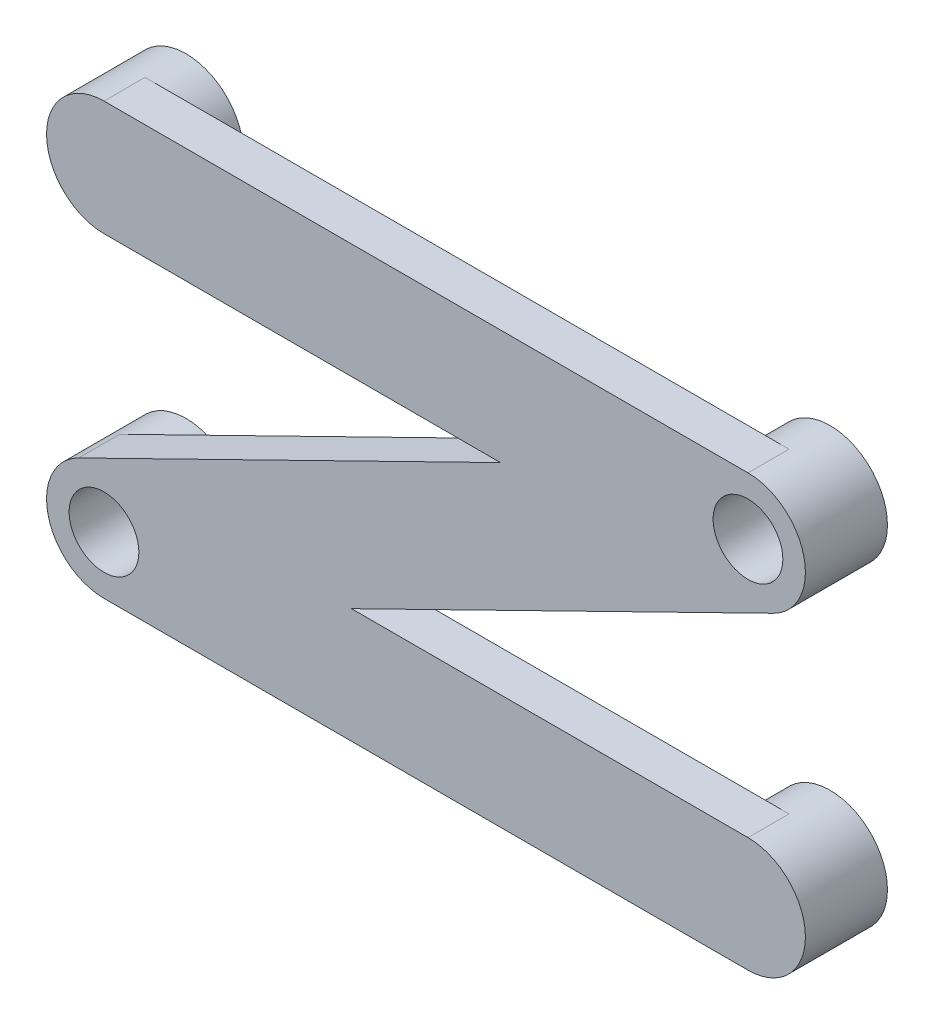
ISO-10303-21;
HEADER;
FILE_DESCRIPTION(('STEP AP214'),'2;1');
FILE_NAME('part.step','',(''),(''),'','','');
FILE_SCHEMA(('AUTOMOTIVE_DESIGN { 1 0 10303 214 1 1 1 1 }'));
ENDSEC;
DATA;
#1=APPLICATION_CONTEXT('core data for automotive mechanical design processes');
#2=APPLICATION_PROTOCOL_DEFINITION('international standard','automotive_design',2000,#1);
#3=PRODUCT_CONTEXT('',#1,'mechanical');
#4=PRODUCT('Part','Part','',(#3));
#5=PRODUCT_RELATED_PRODUCT_CATEGORY('part','',(#4));
#6=PRODUCT_DEFINITION_FORMATION('','',#4);
#7=PRODUCT_DEFINITION_CONTEXT('part definition',#1,'design');
#8=PRODUCT_DEFINITION('design','',#6,#7);
#9=PRODUCT_DEFINITION_SHAPE('','',#8);
#10=(LENGTH_UNIT() NAMED_UNIT(*) SI_UNIT(.MILLI.,.METRE.));
#11=(NAMED_UNIT(*) PLANE_ANGLE_UNIT() SI_UNIT($,.RADIAN.));
#12=(NAMED_UNIT(*) SI_UNIT($,.STERADIAN.) SOLID_ANGLE_UNIT());
#13=UNCERTAINTY_MEASURE_WITH_UNIT(LENGTH_MEASURE(1.E-05),#10,'distance_accuracy_value','');
#14=(GEOMETRIC_REPRESENTATION_CONTEXT(3) GLOBAL_UNCERTAINTY_ASSIGNED_CONTEXT((#13)) GLOBAL_UNIT_ASSIGNED_CONTEXT((#10,
#11,#12)) REPRESENTATION_CONTEXT('',''));
#15=CARTESIAN_POINT('',(0.,0.,0.));
#16=DIRECTION('',(0.,0.,1.));
#17=DIRECTION('',(1.,0.,0.));
#18=AXIS2_PLACEMENT_3D('',#15,#16,#17);
#19=CARTESIAN_POINT('',(0.,10.5,-2.));
#20=DIRECTION('',(0.,-1.,0.));
#21=DIRECTION('',(0.,0.,-1.));
#22=AXIS2_PLACEMENT_3D('',#19,#20,#21);
#23=PLANE('',#22);
#24=DIRECTION('',(1.,0.,0.));
#25=VECTOR('',#24,1.);
#26=CARTESIAN_POINT('',(0.,10.5,0.));
#27=LINE('',#26,#25);
#28=CARTESIAN_POINT('',(-15.7,10.5,0.));
#29=VERTEX_POINT('',#28);
#30=CARTESIAN_POINT('',(15.7,10.5,0.));
#31=VERTEX_POINT('',#30);
#32=EDGE_CURVE('E85',#29,#31,#27,.T.);
#33=ORIENTED_EDGE('',*,*,#32,.T.);
#34=DIRECTION('',(0.,0.,1.));
#35=VECTOR('',#34,1.);
#36=CARTESIAN_POINT('',(15.7,10.5,-2.));
#37=LINE('',#36,#35);
#38=CARTESIAN_POINT('',(15.7,10.5,-2.));
#39=VERTEX_POINT('',#38);
#40=EDGE_CURVE('E48',#39,#31,#37,.T.);
#41=ORIENTED_EDGE('',*,*,#40,.F.);
#42=DIRECTION('',(1.,0.,0.));
#43=VECTOR('',#42,1.);
#44=CARTESIAN_POINT('',(0.,10.5,-2.));
#45=LINE('',#44,#43);
#46=CARTESIAN_POINT('',(-15.7,10.5,-2.));
#47=VERTEX_POINT('',#46);
#48=EDGE_CURVE('E56',#47,#39,#45,.T.);
#49=ORIENTED_EDGE('',*,*,#48,.F.);
#50=DIRECTION('',(0.,0.,1.));
#51=VECTOR('',#50,1.);
#52=CARTESIAN_POINT('',(-15.7,10.5,-2.));
#53=LINE('',#52,#51);
#54=EDGE_CURVE('E11',#47,#29,#53,.T.);
#55=ORIENTED_EDGE('',*,*,#54,.T.);
#56=EDGE_LOOP('',(#33,#41,#49,#55));
#57=FACE_BOUND('',#56,.T.);
#58=ADVANCED_FACE('F38',(#57),#23,.F.);
#59=CARTESIAN_POINT('',(1.23294646096389,-2.51392979703027,-2.));
#60=DIRECTION('',(-0.440338021772817,0.897832070367951,0.));
#61=DIRECTION('',(-0.897832070367951,-0.440338021772817,0.));
#62=AXIS2_PLACEMENT_3D('',#59,#60,#61);
#63=PLANE('',#62);
#64=DIRECTION('',(-0.897832070367951,-0.440338021772817,0.));
#65=VECTOR('',#64,1.);
#66=CARTESIAN_POINT('',(1.23294646096389,-2.51392979703027,0.));
#67=LINE('',#66,#65);
#68=CARTESIAN_POINT('',(16.9329464609639,5.18607020296974,0.));
#69=VERTEX_POINT('',#68);
#70=CARTESIAN_POINT('',(-3.63215771911725,-4.9,0.));
#71=VERTEX_POINT('',#70);
#72=EDGE_CURVE('E80',#69,#71,#67,.T.);
#73=ORIENTED_EDGE('',*,*,#72,.T.);
#74=DIRECTION('',(0.,0.,1.));
#75=VECTOR('',#74,1.);
#76=CARTESIAN_POINT('',(-3.63215771911725,-4.9,-2.));
#77=LINE('',#76,#75);
#78=CARTESIAN_POINT('',(-3.63215771911725,-4.9,-2.));
#79=VERTEX_POINT('',#78);
#80=EDGE_CURVE('E127',#79,#71,#77,.T.);
#81=ORIENTED_EDGE('',*,*,#80,.F.);
#82=DIRECTION('',(-0.897832070367951,-0.440338021772817,0.));
#83=VECTOR('',#82,1.);
#84=CARTESIAN_POINT('',(1.23294646096389,-2.51392979703027,-2.));
#85=LINE('',#84,#83);
#86=CARTESIAN_POINT('',(16.9329464609639,5.18607020296974,-2.));
#87=VERTEX_POINT('',#86);
#88=EDGE_CURVE('E119',#87,#79,#85,.T.);
#89=ORIENTED_EDGE('',*,*,#88,.F.);
#90=DIRECTION('',(0.,0.,1.));
#91=VECTOR('',#90,1.);
#92=CARTESIAN_POINT('',(16.9329464609639,5.18607020296974,-2.));
#93=LINE('',#92,#91);
#94=EDGE_CURVE('E125',#87,#69,#93,.T.);
#95=ORIENTED_EDGE('',*,*,#94,.T.);
#96=EDGE_LOOP('',(#73,#81,#89,#95));
#97=FACE_BOUND('',#96,.T.);
#98=ADVANCED_FACE('F123',(#97),#63,.F.);
#99=CARTESIAN_POINT('',(0.,-4.9,-2.));
#100=DIRECTION('',(0.,-1.,0.));
#101=DIRECTION('',(1.,0.,0.));
#102=AXIS2_PLACEMENT_3D('',#99,#100,#101);
#103=PLANE('',#102);
#104=DIRECTION('',(1.,0.,0.));
#105=VECTOR('',#104,1.);
#106=CARTESIAN_POINT('',(0.,-4.9,0.));
#107=LINE('',#106,#105);
#108=CARTESIAN_POINT('',(15.7,-4.9,0.));
#109=VERTEX_POINT('',#108);
#110=EDGE_CURVE('E168',#71,#109,#107,.T.);
#111=ORIENTED_EDGE('',*,*,#110,.T.);
#112=DIRECTION('',(0.,0.,1.));
#113=VECTOR('',#112,1.);
#114=CARTESIAN_POINT('',(15.7,-4.9,-2.));
#115=LINE('',#114,#113);
#116=CARTESIAN_POINT('',(15.7,-4.9,-2.));
#117=VERTEX_POINT('',#116);
#118=EDGE_CURVE('E137',#117,#109,#115,.T.);
#119=ORIENTED_EDGE('',*,*,#118,.F.);
#120=DIRECTION('',(1.,0.,0.));
#121=VECTOR('',#120,1.);
#122=CARTESIAN_POINT('',(0.,-4.9,-2.));
#123=LINE('',#122,#121);
#124=EDGE_CURVE('E129',#79,#117,#123,.T.);
#125=ORIENTED_EDGE('',*,*,#124,.F.);
#126=ORIENTED_EDGE('',*,*,#80,.T.);
#127=EDGE_LOOP('',(#111,#119,#125,#126));
#128=FACE_BOUND('',#127,.T.);
#129=ADVANCED_FACE('F194',(#128),#103,.F.);
#130=CARTESIAN_POINT('',(0.,-10.5,-2.));
#131=DIRECTION('',(0.,-1.,0.));
#132=DIRECTION('',(1.,0.,0.));
#133=AXIS2_PLACEMENT_3D('',#130,#131,#132);
#134=PLANE('',#133);
#135=DIRECTION('',(1.,0.,0.));
#136=VECTOR('',#135,1.);
#137=CARTESIAN_POINT('',(0.,-10.5,0.));
#138=LINE('',#137,#136);
#139=CARTESIAN_POINT('',(-15.7,-10.5,0.));
#140=VERTEX_POINT('',#139);
#141=CARTESIAN_POINT('',(15.7,-10.5,0.));
#142=VERTEX_POINT('',#141);
#143=EDGE_CURVE('E165',#140,#142,#138,.T.);
#144=ORIENTED_EDGE('',*,*,#143,.F.);
#145=DIRECTION('',(0.,0.,1.));
#146=VECTOR('',#145,1.);
#147=CARTESIAN_POINT('',(-15.7,-10.5,-2.));
#148=LINE('',#147,#146);
#149=CARTESIAN_POINT('',(-15.7,-10.5,-2.));
#150=VERTEX_POINT('',#149);
#151=EDGE_CURVE('E145',#150,#140,#148,.T.);
#152=ORIENTED_EDGE('',*,*,#151,.F.);
#153=DIRECTION('',(1.,0.,0.));
#154=VECTOR('',#153,1.);
#155=CARTESIAN_POINT('',(0.,-10.5,-2.));
#156=LINE('',#155,#154);
#157=CARTESIAN_POINT('',(15.7,-10.5,-2.));
#158=VERTEX_POINT('',#157);
#159=EDGE_CURVE('E185',#150,#158,#156,.T.);
#160=ORIENTED_EDGE('',*,*,#159,.T.);
#161=DIRECTION('',(0.,0.,1.));
#162=VECTOR('',#161,1.);
#163=CARTESIAN_POINT('',(15.7,-10.5,-2.));
#164=LINE('',#163,#162);
#165=EDGE_CURVE('E142',#158,#142,#164,.T.);
#166=ORIENTED_EDGE('',*,*,#165,.T.);
#167=EDGE_LOOP('',(#144,#152,#160,#166));
#168=FACE_BOUND('',#167,.T.);
#169=ADVANCED_FACE('F205',(#168),#134,.T.);
#170=CARTESIAN_POINT('',(-1.23294646096389,2.51392979703027,-2.));
#171=DIRECTION('',(-0.440338021772817,0.897832070367951,0.));
#172=DIRECTION('',(-0.897832070367951,-0.440338021772817,0.));
#173=AXIS2_PLACEMENT_3D('',#170,#171,#172);
#174=PLANE('',#173);
#175=DIRECTION('',(-0.897832070367951,-0.440338021772817,0.));
#176=VECTOR('',#175,1.);
#177=CARTESIAN_POINT('',(-1.23294646096389,2.51392979703027,0.));
#178=LINE('',#177,#176);
#179=CARTESIAN_POINT('',(3.63215771911726,4.9,0.));
#180=VERTEX_POINT('',#179);
#181=CARTESIAN_POINT('',(-16.9329464609639,-5.18607020296974,0.));
#182=VERTEX_POINT('',#181);
#183=EDGE_CURVE('E161',#180,#182,#178,.T.);
#184=ORIENTED_EDGE('',*,*,#183,.F.);
#185=DIRECTION('',(0.,0.,1.));
#186=VECTOR('',#185,1.);
#187=CARTESIAN_POINT('',(3.63215771911726,4.9,-2.));
#188=LINE('',#187,#186);
#189=CARTESIAN_POINT('',(3.63215771911726,4.9,-2.));
#190=VERTEX_POINT('',#189);
#191=EDGE_CURVE('E150',#190,#180,#188,.T.);
#192=ORIENTED_EDGE('',*,*,#191,.F.);
#193=DIRECTION('',(-0.897832070367951,-0.440338021772817,0.));
#194=VECTOR('',#193,1.);
#195=CARTESIAN_POINT('',(-1.23294646096389,2.51392979703027,-2.));
#196=LINE('',#195,#194);
#197=CARTESIAN_POINT('',(-16.9329464609639,-5.18607020296974,-2.));
#198=VERTEX_POINT('',#197);
#199=EDGE_CURVE('E175',#190,#198,#196,.T.);
#200=ORIENTED_EDGE('',*,*,#199,.T.);
#201=DIRECTION('',(0.,0.,1.));
#202=VECTOR('',#201,1.);
#203=CARTESIAN_POINT('',(-16.9329464609639,-5.18607020296974,-2.));
#204=LINE('',#203,#202);
#205=EDGE_CURVE('E148',#198,#182,#204,.T.);
#206=ORIENTED_EDGE('',*,*,#205,.T.);
#207=EDGE_LOOP('',(#184,#192,#200,#206));
#208=FACE_BOUND('',#207,.T.);
#209=ADVANCED_FACE('F217',(#208),#174,.T.);
#210=CARTESIAN_POINT('',(0.,4.9,-2.));
#211=DIRECTION('',(0.,-1.,0.));
#212=DIRECTION('',(1.,0.,0.));
#213=AXIS2_PLACEMENT_3D('',#210,#211,#212);
#214=PLANE('',#213);
#215=DIRECTION('',(1.,0.,0.));
#216=VECTOR('',#215,1.);
#217=CARTESIAN_POINT('',(0.,4.9,0.));
#218=LINE('',#217,#216);
#219=CARTESIAN_POINT('',(-15.7,4.9,0.));
#220=VERTEX_POINT('',#219);
#221=EDGE_CURVE('E158',#220,#180,#218,.T.);
#222=ORIENTED_EDGE('',*,*,#221,.F.);
#223=DIRECTION('',(0.,0.,1.));
#224=VECTOR('',#223,1.);
#225=CARTESIAN_POINT('',(-15.7,4.9,-2.));
#226=LINE('',#225,#224);
#227=CARTESIAN_POINT('',(-15.7,4.9,-2.));
#228=VERTEX_POINT('',#227);
#229=EDGE_CURVE('E42',#228,#220,#226,.T.);
#230=ORIENTED_EDGE('',*,*,#229,.F.);
#231=DIRECTION('',(1.,0.,0.));
#232=VECTOR('',#231,1.);
#233=CARTESIAN_POINT('',(0.,4.9,-2.));
#234=LINE('',#233,#232);
#235=EDGE_CURVE('E172',#228,#190,#234,.T.);
#236=ORIENTED_EDGE('',*,*,#235,.T.);
#237=ORIENTED_EDGE('',*,*,#191,.T.);
#238=EDGE_LOOP('',(#222,#230,#236,#237));
#239=FACE_BOUND('',#238,.T.);
#240=ADVANCED_FACE('F40',(#239),#214,.T.);
#241=CARTESIAN_POINT('',(0.,0.,-2.));
#242=DIRECTION('',(0.,0.,1.));
#243=DIRECTION('',(1.,0.,0.));
#244=AXIS2_PLACEMENT_3D('',#241,#242,#243);
#245=PLANE('',#244);
#246=CARTESIAN_POINT('',(-15.7,7.7,-2.));
#247=DIRECTION('',(0.,0.,1.));
#248=DIRECTION('',(1.,0.,0.));
#249=AXIS2_PLACEMENT_3D('',#246,#247,#248);
#250=CIRCLE('',#249,2.8);
#251=EDGE_CURVE('E171',#228,#47,#250,.T.);
#252=ORIENTED_EDGE('',*,*,#251,.T.);
#253=ORIENTED_EDGE('',*,*,#48,.T.);
#254=CARTESIAN_POINT('',(15.7,7.7,-2.));
#255=DIRECTION('',(0.,0.,1.));
#256=DIRECTION('',(1.,0.,0.));
#257=AXIS2_PLACEMENT_3D('',#254,#255,#256);
#258=CIRCLE('',#257,2.8);
#259=EDGE_CURVE('E116',#39,#87,#258,.T.);
#260=ORIENTED_EDGE('',*,*,#259,.T.);
#261=ORIENTED_EDGE('',*,*,#88,.T.);
#262=ORIENTED_EDGE('',*,*,#124,.T.);
#263=CARTESIAN_POINT('',(15.7,-7.7,-2.));
#264=DIRECTION('',(0.,0.,1.));
#265=DIRECTION('',(1.,0.,0.));
#266=AXIS2_PLACEMENT_3D('',#263,#264,#265);
#267=CIRCLE('',#266,2.8);
#268=EDGE_CURVE('E188',#117,#158,#267,.T.);
#269=ORIENTED_EDGE('',*,*,#268,.T.);
#270=ORIENTED_EDGE('',*,*,#159,.F.);
#271=CARTESIAN_POINT('',(-15.7,-7.7,-2.));
#272=DIRECTION('',(0.,0.,1.));
#273=DIRECTION('',(1.,0.,0.));
#274=AXIS2_PLACEMENT_3D('',#271,#272,#273);
#275=CIRCLE('',#274,2.8);
#276=EDGE_CURVE('E183',#150,#198,#275,.T.);
#277=ORIENTED_EDGE('',*,*,#276,.T.);
#278=ORIENTED_EDGE('',*,*,#199,.F.);
#279=ORIENTED_EDGE('',*,*,#235,.F.);
#280=EDGE_LOOP('',(#252,#253,#260,#261,#262,#269,#270,#277,#278,#279));
#281=FACE_BOUND('',#280,.T.);
#282=ADVANCED_FACE('F118',(#281),#245,.F.);
#283=CARTESIAN_POINT('',(0.,0.,0.));
#284=DIRECTION('',(0.,0.,1.));
#285=DIRECTION('',(1.,0.,0.));
#286=AXIS2_PLACEMENT_3D('',#283,#284,#285);
#287=PLANE('',#286);
#288=ORIENTED_EDGE('',*,*,#32,.F.);
#289=CARTESIAN_POINT('',(-15.7,7.7,0.));
#290=DIRECTION('',(0.,0.,1.));
#291=DIRECTION('',(1.,0.,0.));
#292=AXIS2_PLACEMENT_3D('',#289,#290,#291);
#293=CIRCLE('',#292,2.8);
#294=EDGE_CURVE('E178',#29,#220,#293,.T.);
#295=ORIENTED_EDGE('',*,*,#294,.T.);
#296=ORIENTED_EDGE('',*,*,#221,.T.);
#297=ORIENTED_EDGE('',*,*,#183,.T.);
#298=CARTESIAN_POINT('',(-15.7,-7.7,0.));
#299=DIRECTION('',(0.,0.,1.));
#300=DIRECTION('',(1.,0.,0.));
#301=AXIS2_PLACEMENT_3D('',#298,#299,#300);
#302=CIRCLE('',#301,2.8);
#303=EDGE_CURVE('E214',#182,#140,#302,.T.);
#304=ORIENTED_EDGE('',*,*,#303,.T.);
#305=ORIENTED_EDGE('',*,*,#143,.T.);
#306=CARTESIAN_POINT('',(15.7,-7.7,0.));
#307=DIRECTION('',(0.,0.,1.));
#308=DIRECTION('',(1.,0.,0.));
#309=AXIS2_PLACEMENT_3D('',#306,#307,#308);
#310=CIRCLE('',#309,2.8);
#311=EDGE_CURVE('E203',#142,#109,#310,.T.);
#312=ORIENTED_EDGE('',*,*,#311,.T.);
#313=ORIENTED_EDGE('',*,*,#110,.F.);
#314=ORIENTED_EDGE('',*,*,#72,.F.);
#315=CARTESIAN_POINT('',(15.7,7.7,0.));
#316=DIRECTION('',(0.,0.,1.));
#317=DIRECTION('',(1.,0.,0.));
#318=AXIS2_PLACEMENT_3D('',#315,#316,#317);
#319=CIRCLE('',#318,2.8);
#320=EDGE_CURVE('E134',#69,#31,#319,.T.);
#321=ORIENTED_EDGE('',*,*,#320,.T.);
#322=EDGE_LOOP('',(#288,#295,#296,#297,#304,#305,#312,#313,#314,#321));
#323=FACE_BOUND('',#322,.T.);
#324=CARTESIAN_POINT('',(15.7,7.7,0.));
#325=DIRECTION('',(0.,0.,1.));
#326=DIRECTION('',(1.,0.,0.));
#327=AXIS2_PLACEMENT_3D('',#324,#325,#326);
#328=CIRCLE('',#327,1.7);
#329=CARTESIAN_POINT('',(17.4,7.7,0.));
#330=VERTEX_POINT('',#329);
#331=EDGE_CURVE('E236',#330,#330,#328,.T.);
#332=ORIENTED_EDGE('',*,*,#331,.F.);
#333=EDGE_LOOP('',(#332));
#334=FACE_BOUND('',#333,.T.);
#335=CARTESIAN_POINT('',(-15.7,-7.7,0.));
#336=DIRECTION('',(0.,0.,1.));
#337=DIRECTION('',(1.,0.,0.));
#338=AXIS2_PLACEMENT_3D('',#335,#336,#337);
#339=CIRCLE('',#338,1.7);
#340=CARTESIAN_POINT('',(-14.,-7.7,0.));
#341=VERTEX_POINT('',#340);
#342=EDGE_CURVE('E224',#341,#341,#339,.T.);
#343=ORIENTED_EDGE('',*,*,#342,.F.);
#344=EDGE_LOOP('',(#343));
#345=FACE_BOUND('',#344,.T.);
#346=ADVANCED_FACE('F211',(#323,#334,#345),#287,.T.);
#347=CARTESIAN_POINT('',(-15.7,7.7,-4.));
#348=DIRECTION('',(0.,0.,1.));
#349=DIRECTION('',(1.,0.,0.));
#350=AXIS2_PLACEMENT_3D('',#347,#348,#349);
#351=CYLINDRICAL_SURFACE('',#350,2.8);
#352=CARTESIAN_POINT('',(-15.7,7.7,-4.));
#353=DIRECTION('',(0.,0.,1.));
#354=DIRECTION('',(1.,0.,0.));
#355=AXIS2_PLACEMENT_3D('',#352,#353,#354);
#356=CIRCLE('',#355,2.8);
#357=CARTESIAN_POINT('',(-12.9,7.7,-4.));
#358=VERTEX_POINT('',#357);
#359=EDGE_CURVE('E162',#358,#358,#356,.T.);
#360=ORIENTED_EDGE('',*,*,#359,.T.);
#361=EDGE_LOOP('',(#360));
#362=FACE_BOUND('',#361,.T.);
#363=ORIENTED_EDGE('',*,*,#54,.F.);
#364=ORIENTED_EDGE('',*,*,#251,.F.);
#365=ORIENTED_EDGE('',*,*,#229,.T.);
#366=ORIENTED_EDGE('',*,*,#294,.F.);
#367=EDGE_LOOP('',(#363,#364,#365,#366));
#368=FACE_BOUND('',#367,.T.);
#369=ADVANCED_FACE('F249',(#362,#368),#351,.T.);
#370=CARTESIAN_POINT('',(0.,0.,-4.));
#371=DIRECTION('',(0.,0.,1.));
#372=DIRECTION('',(1.,0.,0.));
#373=AXIS2_PLACEMENT_3D('',#370,#371,#372);
#374=PLANE('',#373);
#375=ORIENTED_EDGE('',*,*,#359,.F.);
#376=EDGE_LOOP('',(#375));
#377=FACE_BOUND('',#376,.T.);
#378=ADVANCED_FACE('F275',(#377),#374,.F.);
#379=CARTESIAN_POINT('',(15.7,7.7,-4.));
#380=DIRECTION('',(0.,0.,1.));
#381=DIRECTION('',(1.,0.,0.));
#382=AXIS2_PLACEMENT_3D('',#379,#380,#381);
#383=CYLINDRICAL_SURFACE('',#382,1.7);
#384=CARTESIAN_POINT('',(15.7,7.7,-4.));
#385=DIRECTION('',(0.,0.,1.));
#386=DIRECTION('',(1.,0.,0.));
#387=AXIS2_PLACEMENT_3D('',#384,#385,#386);
#388=CIRCLE('',#387,1.7);
#389=CARTESIAN_POINT('',(17.4,7.7,-4.));
#390=VERTEX_POINT('',#389);
#391=EDGE_CURVE('E238',#390,#390,#388,.T.);
#392=ORIENTED_EDGE('',*,*,#391,.F.);
#393=EDGE_LOOP('',(#392));
#394=FACE_BOUND('',#393,.T.);
#395=ORIENTED_EDGE('',*,*,#331,.T.);
#396=EDGE_LOOP('',(#395));
#397=FACE_BOUND('',#396,.T.);
#398=ADVANCED_FACE('F278',(#394,#397),#383,.F.);
#399=CARTESIAN_POINT('',(15.7,7.7,-4.));
#400=DIRECTION('',(0.,0.,1.));
#401=DIRECTION('',(1.,0.,0.));
#402=AXIS2_PLACEMENT_3D('',#399,#400,#401);
#403=CYLINDRICAL_SURFACE('',#402,2.8);
#404=ORIENTED_EDGE('',*,*,#259,.F.);
#405=ORIENTED_EDGE('',*,*,#40,.T.);
#406=ORIENTED_EDGE('',*,*,#320,.F.);
#407=ORIENTED_EDGE('',*,*,#94,.F.);
#408=EDGE_LOOP('',(#404,#405,#406,#407));
#409=FACE_BOUND('',#408,.T.);
#410=CARTESIAN_POINT('',(15.7,7.7,-4.));
#411=DIRECTION('',(0.,0.,1.));
#412=DIRECTION('',(1.,0.,0.));
#413=AXIS2_PLACEMENT_3D('',#410,#411,#412);
#414=CIRCLE('',#413,2.8);
#415=CARTESIAN_POINT('',(18.5,7.7,-4.));
#416=VERTEX_POINT('',#415);
#417=EDGE_CURVE('E241',#416,#416,#414,.T.);
#418=ORIENTED_EDGE('',*,*,#417,.T.);
#419=EDGE_LOOP('',(#418));
#420=FACE_BOUND('',#419,.T.);
#421=ADVANCED_FACE('F131',(#409,#420),#403,.T.);
#422=CARTESIAN_POINT('',(0.,0.,-4.));
#423=DIRECTION('',(0.,0.,1.));
#424=DIRECTION('',(1.,0.,0.));
#425=AXIS2_PLACEMENT_3D('',#422,#423,#424);
#426=PLANE('',#425);
#427=ORIENTED_EDGE('',*,*,#391,.T.);
#428=EDGE_LOOP('',(#427));
#429=FACE_BOUND('',#428,.T.);
#430=ORIENTED_EDGE('',*,*,#417,.F.);
#431=EDGE_LOOP('',(#430));
#432=FACE_BOUND('',#431,.T.);
#433=ADVANCED_FACE('F285',(#429,#432),#426,.F.);
#434=CARTESIAN_POINT('',(15.7,-7.7,-4.));
#435=DIRECTION('',(0.,0.,1.));
#436=DIRECTION('',(1.,0.,0.));
#437=AXIS2_PLACEMENT_3D('',#434,#435,#436);
#438=CYLINDRICAL_SURFACE('',#437,2.8);
#439=ORIENTED_EDGE('',*,*,#268,.F.);
#440=ORIENTED_EDGE('',*,*,#118,.T.);
#441=ORIENTED_EDGE('',*,*,#311,.F.);
#442=ORIENTED_EDGE('',*,*,#165,.F.);
#443=EDGE_LOOP('',(#439,#440,#441,#442));
#444=FACE_BOUND('',#443,.T.);
#445=CARTESIAN_POINT('',(15.7,-7.7,-4.));
#446=DIRECTION('',(0.,0.,1.));
#447=DIRECTION('',(1.,0.,0.));
#448=AXIS2_PLACEMENT_3D('',#445,#446,#447);
#449=CIRCLE('',#448,2.8);
#450=CARTESIAN_POINT('',(18.5,-7.7,-4.));
#451=VERTEX_POINT('',#450);
#452=EDGE_CURVE('E233',#451,#451,#449,.T.);
#453=ORIENTED_EDGE('',*,*,#452,.T.);
#454=EDGE_LOOP('',(#453));
#455=FACE_BOUND('',#454,.T.);
#456=ADVANCED_FACE('F200',(#444,#455),#438,.T.);
#457=CARTESIAN_POINT('',(0.,0.,-4.));
#458=DIRECTION('',(0.,0.,1.));
#459=DIRECTION('',(1.,0.,0.));
#460=AXIS2_PLACEMENT_3D('',#457,#458,#459);
#461=PLANE('',#460);
#462=ORIENTED_EDGE('',*,*,#452,.F.);
#463=EDGE_LOOP('',(#462));
#464=FACE_BOUND('',#463,.T.);
#465=ADVANCED_FACE('F291',(#464),#461,.F.);
#466=CARTESIAN_POINT('',(-15.7,-7.7,-4.));
#467=DIRECTION('',(0.,0.,1.));
#468=DIRECTION('',(1.,0.,0.));
#469=AXIS2_PLACEMENT_3D('',#466,#467,#468);
#470=CYLINDRICAL_SURFACE('',#469,1.7);
#471=CARTESIAN_POINT('',(-15.7,-7.7,-4.));
#472=DIRECTION('',(0.,0.,1.));
#473=DIRECTION('',(1.,0.,0.));
#474=AXIS2_PLACEMENT_3D('',#471,#472,#473);
#475=CIRCLE('',#474,1.7);
#476=CARTESIAN_POINT('',(-14.,-7.7,-4.));
#477=VERTEX_POINT('',#476);
#478=EDGE_CURVE('E223',#477,#477,#475,.T.);
#479=ORIENTED_EDGE('',*,*,#478,.F.);
#480=EDGE_LOOP('',(#479));
#481=FACE_BOUND('',#480,.T.);
#482=ORIENTED_EDGE('',*,*,#342,.T.);
#483=EDGE_LOOP('',(#482));
#484=FACE_BOUND('',#483,.T.);
#485=ADVANCED_FACE('F294',(#481,#484),#470,.F.);
#486=CARTESIAN_POINT('',(-15.7,-7.7,-4.));
#487=DIRECTION('',(0.,0.,1.));
#488=DIRECTION('',(1.,0.,0.));
#489=AXIS2_PLACEMENT_3D('',#486,#487,#488);
#490=CYLINDRICAL_SURFACE('',#489,2.8);
#491=ORIENTED_EDGE('',*,*,#276,.F.);
#492=ORIENTED_EDGE('',*,*,#151,.T.);
#493=ORIENTED_EDGE('',*,*,#303,.F.);
#494=ORIENTED_EDGE('',*,*,#205,.F.);
#495=EDGE_LOOP('',(#491,#492,#493,#494));
#496=FACE_BOUND('',#495,.T.);
#497=CARTESIAN_POINT('',(-15.7,-7.7,-4.));
#498=DIRECTION('',(0.,0.,1.));
#499=DIRECTION('',(1.,0.,0.));
#500=AXIS2_PLACEMENT_3D('',#497,#498,#499);
#501=CIRCLE('',#500,2.8);
#502=CARTESIAN_POINT('',(-12.9,-7.7,-4.));
#503=VERTEX_POINT('',#502);
#504=EDGE_CURVE('E227',#503,#503,#501,.T.);
#505=ORIENTED_EDGE('',*,*,#504,.T.);
#506=EDGE_LOOP('',(#505));
#507=FACE_BOUND('',#506,.T.);
#508=ADVANCED_FACE('F221',(#496,#507),#490,.T.);
#509=CARTESIAN_POINT('',(0.,0.,-4.));
#510=DIRECTION('',(0.,0.,1.));
#511=DIRECTION('',(1.,0.,0.));
#512=AXIS2_PLACEMENT_3D('',#509,#510,#511);
#513=PLANE('',#512);
#514=ORIENTED_EDGE('',*,*,#478,.T.);
#515=EDGE_LOOP('',(#514));
#516=FACE_BOUND('',#515,.T.);
#517=ORIENTED_EDGE('',*,*,#504,.F.);
#518=EDGE_LOOP('',(#517));
#519=FACE_BOUND('',#518,.T.);
#520=ADVANCED_FACE('F301',(#516,#519),#513,.F.);
#521=CLOSED_SHELL('',(#58,#98,#129,#169,#209,#240,#282,#346,#369,#378,#398,#421,#433,#456,#465,
#485,#508,#520));
#522=MANIFOLD_SOLID_BREP('B2',#521);
#523=ADVANCED_BREP_SHAPE_REPRESENTATION('',(#18,#522),#14);
#524=SHAPE_DEFINITION_REPRESENTATION(#9,#523);
ENDSEC;
END-ISO-10303-21;
